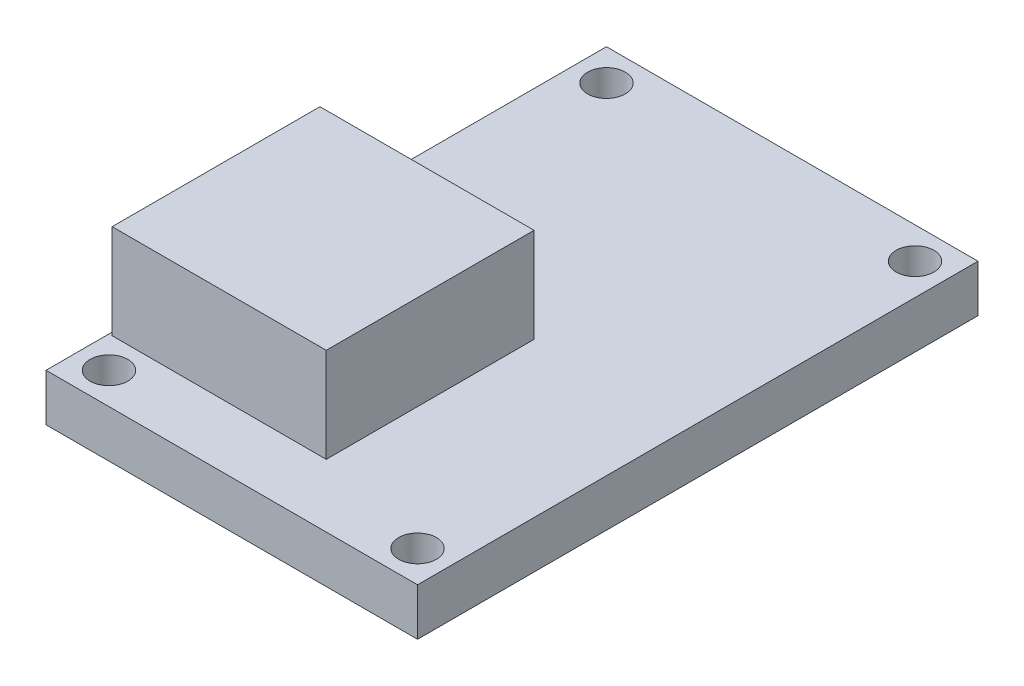
ISO-10303-21;
HEADER;
FILE_DESCRIPTION(('STEP AP214'),'2;1');
FILE_NAME('part.step','',(''),(''),'','','');
FILE_SCHEMA(('AUTOMOTIVE_DESIGN { 1 0 10303 214 1 1 1 1 }'));
ENDSEC;
DATA;
#1=APPLICATION_CONTEXT('core data for automotive mechanical design processes');
#2=APPLICATION_PROTOCOL_DEFINITION('international standard','automotive_design',2000,#1);
#3=PRODUCT_CONTEXT('',#1,'mechanical');
#4=PRODUCT('Part','Part','',(#3));
#5=PRODUCT_RELATED_PRODUCT_CATEGORY('part','',(#4));
#6=PRODUCT_DEFINITION_FORMATION('','',#4);
#7=PRODUCT_DEFINITION_CONTEXT('part definition',#1,'design');
#8=PRODUCT_DEFINITION('design','',#6,#7);
#9=PRODUCT_DEFINITION_SHAPE('','',#8);
#10=(LENGTH_UNIT() NAMED_UNIT(*) SI_UNIT(.MILLI.,.METRE.));
#11=(NAMED_UNIT(*) PLANE_ANGLE_UNIT() SI_UNIT($,.RADIAN.));
#12=(NAMED_UNIT(*) SI_UNIT($,.STERADIAN.) SOLID_ANGLE_UNIT());
#13=UNCERTAINTY_MEASURE_WITH_UNIT(LENGTH_MEASURE(1.E-05),#10,'distance_accuracy_value','');
#14=(GEOMETRIC_REPRESENTATION_CONTEXT(3) GLOBAL_UNCERTAINTY_ASSIGNED_CONTEXT((#13)) GLOBAL_UNIT_ASSIGNED_CONTEXT((#10,
#11,#12)) REPRESENTATION_CONTEXT('',''));
#15=CARTESIAN_POINT('',(0.,0.,0.));
#16=DIRECTION('',(0.,0.,1.));
#17=DIRECTION('',(1.,0.,0.));
#18=AXIS2_PLACEMENT_3D('',#15,#16,#17);
#19=CARTESIAN_POINT('',(0.,1.5,0.));
#20=DIRECTION('',(0.,-1.,0.));
#21=DIRECTION('',(0.,0.,-1.));
#22=AXIS2_PLACEMENT_3D('',#19,#20,#21);
#23=PLANE('',#22);
#24=CARTESIAN_POINT('',(-4.9,1.5,7.9));
#25=DIRECTION('',(0.,1.,0.));
#26=DIRECTION('',(0.,0.,1.));
#27=AXIS2_PLACEMENT_3D('',#24,#25,#26);
#28=CIRCLE('',#27,0.6);
#29=CARTESIAN_POINT('',(-4.9,1.5,8.5));
#30=VERTEX_POINT('',#29);
#31=EDGE_CURVE('E134',#30,#30,#28,.T.);
#32=ORIENTED_EDGE('',*,*,#31,.F.);
#33=EDGE_LOOP('',(#32));
#34=FACE_BOUND('',#33,.T.);
#35=CARTESIAN_POINT('',(4.9,1.5,7.9));
#36=DIRECTION('',(0.,1.,0.));
#37=DIRECTION('',(0.,0.,1.));
#38=AXIS2_PLACEMENT_3D('',#35,#36,#37);
#39=CIRCLE('',#38,0.6);
#40=CARTESIAN_POINT('',(4.9,1.5,8.5));
#41=VERTEX_POINT('',#40);
#42=EDGE_CURVE('E144',#41,#41,#39,.T.);
#43=ORIENTED_EDGE('',*,*,#42,.F.);
#44=EDGE_LOOP('',(#43));
#45=FACE_BOUND('',#44,.T.);
#46=CARTESIAN_POINT('',(4.9,1.5,-7.9));
#47=DIRECTION('',(0.,1.,0.));
#48=DIRECTION('',(0.,0.,1.));
#49=AXIS2_PLACEMENT_3D('',#46,#47,#48);
#50=CIRCLE('',#49,0.6);
#51=CARTESIAN_POINT('',(4.9,1.5,-7.3));
#52=VERTEX_POINT('',#51);
#53=EDGE_CURVE('E152',#52,#52,#50,.T.);
#54=ORIENTED_EDGE('',*,*,#53,.F.);
#55=EDGE_LOOP('',(#54));
#56=FACE_BOUND('',#55,.T.);
#57=CARTESIAN_POINT('',(-4.9,1.5,-7.9));
#58=DIRECTION('',(0.,1.,0.));
#59=DIRECTION('',(0.,0.,1.));
#60=AXIS2_PLACEMENT_3D('',#57,#58,#59);
#61=CIRCLE('',#60,0.6);
#62=CARTESIAN_POINT('',(-4.9,1.5,-7.3));
#63=VERTEX_POINT('',#62);
#64=EDGE_CURVE('E160',#63,#63,#61,.T.);
#65=ORIENTED_EDGE('',*,*,#64,.F.);
#66=EDGE_LOOP('',(#65));
#67=FACE_BOUND('',#66,.T.);
#68=DIRECTION('',(0.,0.,-1.));
#69=VECTOR('',#68,1.);
#70=CARTESIAN_POINT('',(5.9,1.5,8.9));
#71=LINE('',#70,#69);
#72=CARTESIAN_POINT('',(5.9,1.5,8.9));
#73=VERTEX_POINT('',#72);
#74=CARTESIAN_POINT('',(5.9,1.5,-8.9));
#75=VERTEX_POINT('',#74);
#76=EDGE_CURVE('E168',#73,#75,#71,.T.);
#77=ORIENTED_EDGE('',*,*,#76,.T.);
#78=DIRECTION('',(-1.,0.,0.));
#79=VECTOR('',#78,1.);
#80=CARTESIAN_POINT('',(-5.9,1.5,-8.9));
#81=LINE('',#80,#79);
#82=CARTESIAN_POINT('',(-5.9,1.5,-8.9));
#83=VERTEX_POINT('',#82);
#84=EDGE_CURVE('E172',#75,#83,#81,.T.);
#85=ORIENTED_EDGE('',*,*,#84,.T.);
#86=DIRECTION('',(0.,0.,1.));
#87=VECTOR('',#86,1.);
#88=CARTESIAN_POINT('',(-5.9,1.5,8.9));
#89=LINE('',#88,#87);
#90=CARTESIAN_POINT('',(-5.9,1.5,8.9));
#91=VERTEX_POINT('',#90);
#92=EDGE_CURVE('E176',#83,#91,#89,.T.);
#93=ORIENTED_EDGE('',*,*,#92,.T.);
#94=DIRECTION('',(1.,0.,0.));
#95=VECTOR('',#94,1.);
#96=CARTESIAN_POINT('',(-5.9,1.5,8.9));
#97=LINE('',#96,#95);
#98=EDGE_CURVE('E179',#91,#73,#97,.T.);
#99=ORIENTED_EDGE('',*,*,#98,.T.);
#100=EDGE_LOOP('',(#77,#85,#93,#99));
#101=FACE_BOUND('',#100,.T.);
#102=DIRECTION('',(0.,0.,1.));
#103=VECTOR('',#102,1.);
#104=CARTESIAN_POINT('',(-5.8,1.5,0.299999999999996));
#105=LINE('',#104,#103);
#106=CARTESIAN_POINT('',(-5.8,1.5,0.299999999999996));
#107=VERTEX_POINT('',#106);
#108=CARTESIAN_POINT('',(-5.8,1.5,6.9));
#109=VERTEX_POINT('',#108);
#110=EDGE_CURVE('E127',#107,#109,#105,.T.);
#111=ORIENTED_EDGE('',*,*,#110,.F.);
#112=DIRECTION('',(-1.,0.,0.));
#113=VECTOR('',#112,1.);
#114=CARTESIAN_POINT('',(-5.8,1.5,0.299999999999996));
#115=LINE('',#114,#113);
#116=CARTESIAN_POINT('',(1.,1.5,0.299999999999996));
#117=VERTEX_POINT('',#116);
#118=EDGE_CURVE('E124',#117,#107,#115,.T.);
#119=ORIENTED_EDGE('',*,*,#118,.F.);
#120=DIRECTION('',(0.,0.,-1.));
#121=VECTOR('',#120,1.);
#122=CARTESIAN_POINT('',(1.,1.5,0.299999999999996));
#123=LINE('',#122,#121);
#124=CARTESIAN_POINT('',(1.,1.5,6.9));
#125=VERTEX_POINT('',#124);
#126=EDGE_CURVE('E60',#125,#117,#123,.T.);
#127=ORIENTED_EDGE('',*,*,#126,.F.);
#128=DIRECTION('',(1.,0.,0.));
#129=VECTOR('',#128,1.);
#130=CARTESIAN_POINT('',(-5.8,1.5,6.9));
#131=LINE('',#130,#129);
#132=EDGE_CURVE('E55',#109,#125,#131,.T.);
#133=ORIENTED_EDGE('',*,*,#132,.F.);
#134=EDGE_LOOP('',(#111,#119,#127,#133));
#135=FACE_BOUND('',#134,.T.);
#136=ADVANCED_FACE('F39',(#34,#45,#56,#67,#101,#135),#23,.F.);
#137=CARTESIAN_POINT('',(0.,0.,0.));
#138=DIRECTION('',(0.,-1.,0.));
#139=DIRECTION('',(0.,0.,-1.));
#140=AXIS2_PLACEMENT_3D('',#137,#138,#139);
#141=PLANE('',#140);
#142=CARTESIAN_POINT('',(4.9,0.,7.9));
#143=DIRECTION('',(0.,1.,0.));
#144=DIRECTION('',(0.,0.,1.));
#145=AXIS2_PLACEMENT_3D('',#142,#143,#144);
#146=CIRCLE('',#145,0.6);
#147=CARTESIAN_POINT('',(4.9,0.,8.5));
#148=VERTEX_POINT('',#147);
#149=EDGE_CURVE('E142',#148,#148,#146,.T.);
#150=ORIENTED_EDGE('',*,*,#149,.T.);
#151=EDGE_LOOP('',(#150));
#152=FACE_BOUND('',#151,.T.);
#153=CARTESIAN_POINT('',(-4.9,0.,-7.9));
#154=DIRECTION('',(0.,1.,0.));
#155=DIRECTION('',(0.,0.,1.));
#156=AXIS2_PLACEMENT_3D('',#153,#154,#155);
#157=CIRCLE('',#156,0.6);
#158=CARTESIAN_POINT('',(-4.9,0.,-7.3));
#159=VERTEX_POINT('',#158);
#160=EDGE_CURVE('E156',#159,#159,#157,.T.);
#161=ORIENTED_EDGE('',*,*,#160,.T.);
#162=EDGE_LOOP('',(#161));
#163=FACE_BOUND('',#162,.T.);
#164=DIRECTION('',(0.,0.,-1.));
#165=VECTOR('',#164,1.);
#166=CARTESIAN_POINT('',(5.9,0.,8.9));
#167=LINE('',#166,#165);
#168=CARTESIAN_POINT('',(5.9,0.,8.9));
#169=VERTEX_POINT('',#168);
#170=CARTESIAN_POINT('',(5.9,0.,-8.9));
#171=VERTEX_POINT('',#170);
#172=EDGE_CURVE('E164',#169,#171,#167,.T.);
#173=ORIENTED_EDGE('',*,*,#172,.F.);
#174=DIRECTION('',(1.,0.,0.));
#175=VECTOR('',#174,1.);
#176=CARTESIAN_POINT('',(-5.9,0.,8.9));
#177=LINE('',#176,#175);
#178=CARTESIAN_POINT('',(-5.9,0.,8.9));
#179=VERTEX_POINT('',#178);
#180=EDGE_CURVE('E173',#179,#169,#177,.T.);
#181=ORIENTED_EDGE('',*,*,#180,.F.);
#182=DIRECTION('',(0.,0.,1.));
#183=VECTOR('',#182,1.);
#184=CARTESIAN_POINT('',(-5.9,0.,8.9));
#185=LINE('',#184,#183);
#186=CARTESIAN_POINT('',(-5.9,0.,-8.9));
#187=VERTEX_POINT('',#186);
#188=EDGE_CURVE('E189',#187,#179,#185,.T.);
#189=ORIENTED_EDGE('',*,*,#188,.F.);
#190=DIRECTION('',(-1.,0.,0.));
#191=VECTOR('',#190,1.);
#192=CARTESIAN_POINT('',(-5.9,0.,-8.9));
#193=LINE('',#192,#191);
#194=EDGE_CURVE('E186',#171,#187,#193,.T.);
#195=ORIENTED_EDGE('',*,*,#194,.F.);
#196=EDGE_LOOP('',(#173,#181,#189,#195));
#197=FACE_BOUND('',#196,.T.);
#198=CARTESIAN_POINT('',(4.9,0.,-7.9));
#199=DIRECTION('',(0.,1.,0.));
#200=DIRECTION('',(0.,0.,1.));
#201=AXIS2_PLACEMENT_3D('',#198,#199,#200);
#202=CIRCLE('',#201,0.6);
#203=CARTESIAN_POINT('',(4.9,0.,-7.3));
#204=VERTEX_POINT('',#203);
#205=EDGE_CURVE('E148',#204,#204,#202,.T.);
#206=ORIENTED_EDGE('',*,*,#205,.T.);
#207=EDGE_LOOP('',(#206));
#208=FACE_BOUND('',#207,.T.);
#209=CARTESIAN_POINT('',(-4.9,0.,7.9));
#210=DIRECTION('',(0.,1.,0.));
#211=DIRECTION('',(0.,0.,1.));
#212=AXIS2_PLACEMENT_3D('',#209,#210,#211);
#213=CIRCLE('',#212,0.6);
#214=CARTESIAN_POINT('',(-4.9,0.,8.5));
#215=VERTEX_POINT('',#214);
#216=EDGE_CURVE('E129',#215,#215,#213,.T.);
#217=ORIENTED_EDGE('',*,*,#216,.T.);
#218=EDGE_LOOP('',(#217));
#219=FACE_BOUND('',#218,.T.);
#220=ADVANCED_FACE('F212',(#152,#163,#197,#208,#219),#141,.T.);
#221=CARTESIAN_POINT('',(5.9,1.5,8.9));
#222=DIRECTION('',(-1.,0.,0.));
#223=DIRECTION('',(0.,0.,1.));
#224=AXIS2_PLACEMENT_3D('',#221,#222,#223);
#225=PLANE('',#224);
#226=ORIENTED_EDGE('',*,*,#172,.T.);
#227=DIRECTION('',(0.,-1.,0.));
#228=VECTOR('',#227,1.);
#229=CARTESIAN_POINT('',(5.9,1.5,-8.9));
#230=LINE('',#229,#228);
#231=EDGE_CURVE('E11',#75,#171,#230,.T.);
#232=ORIENTED_EDGE('',*,*,#231,.F.);
#233=ORIENTED_EDGE('',*,*,#76,.F.);
#234=DIRECTION('',(0.,-1.,0.));
#235=VECTOR('',#234,1.);
#236=CARTESIAN_POINT('',(5.9,1.5,8.9));
#237=LINE('',#236,#235);
#238=EDGE_CURVE('E182',#73,#169,#237,.T.);
#239=ORIENTED_EDGE('',*,*,#238,.T.);
#240=EDGE_LOOP('',(#226,#232,#233,#239));
#241=FACE_BOUND('',#240,.T.);
#242=ADVANCED_FACE('F41',(#241),#225,.F.);
#243=CARTESIAN_POINT('',(-5.9,1.5,-8.9));
#244=DIRECTION('',(0.,0.,1.));
#245=DIRECTION('',(1.,0.,0.));
#246=AXIS2_PLACEMENT_3D('',#243,#244,#245);
#247=PLANE('',#246);
#248=ORIENTED_EDGE('',*,*,#194,.T.);
#249=DIRECTION('',(0.,-1.,0.));
#250=VECTOR('',#249,1.);
#251=CARTESIAN_POINT('',(-5.9,1.5,-8.9));
#252=LINE('',#251,#250);
#253=EDGE_CURVE('E48',#83,#187,#252,.T.);
#254=ORIENTED_EDGE('',*,*,#253,.F.);
#255=ORIENTED_EDGE('',*,*,#84,.F.);
#256=ORIENTED_EDGE('',*,*,#231,.T.);
#257=EDGE_LOOP('',(#248,#254,#255,#256));
#258=FACE_BOUND('',#257,.T.);
#259=ADVANCED_FACE('F222',(#258),#247,.F.);
#260=CARTESIAN_POINT('',(-5.9,1.5,8.9));
#261=DIRECTION('',(1.,0.,0.));
#262=DIRECTION('',(0.,0.,-1.));
#263=AXIS2_PLACEMENT_3D('',#260,#261,#262);
#264=PLANE('',#263);
#265=ORIENTED_EDGE('',*,*,#188,.T.);
#266=DIRECTION('',(0.,-1.,0.));
#267=VECTOR('',#266,1.);
#268=CARTESIAN_POINT('',(-5.9,1.5,8.9));
#269=LINE('',#268,#267);
#270=EDGE_CURVE('E197',#91,#179,#269,.T.);
#271=ORIENTED_EDGE('',*,*,#270,.F.);
#272=ORIENTED_EDGE('',*,*,#92,.F.);
#273=ORIENTED_EDGE('',*,*,#253,.T.);
#274=EDGE_LOOP('',(#265,#271,#272,#273));
#275=FACE_BOUND('',#274,.T.);
#276=ADVANCED_FACE('F206',(#275),#264,.F.);
#277=CARTESIAN_POINT('',(-5.9,1.5,8.9));
#278=DIRECTION('',(0.,0.,-1.));
#279=DIRECTION('',(-1.,0.,0.));
#280=AXIS2_PLACEMENT_3D('',#277,#278,#279);
#281=PLANE('',#280);
#282=ORIENTED_EDGE('',*,*,#180,.T.);
#283=ORIENTED_EDGE('',*,*,#238,.F.);
#284=ORIENTED_EDGE('',*,*,#98,.F.);
#285=ORIENTED_EDGE('',*,*,#270,.T.);
#286=EDGE_LOOP('',(#282,#283,#284,#285));
#287=FACE_BOUND('',#286,.T.);
#288=ADVANCED_FACE('F216',(#287),#281,.F.);
#289=CARTESIAN_POINT('',(-4.9,1.5,-7.9));
#290=DIRECTION('',(0.,-1.,0.));
#291=DIRECTION('',(0.,0.,-1.));
#292=AXIS2_PLACEMENT_3D('',#289,#290,#291);
#293=CYLINDRICAL_SURFACE('',#292,0.6);
#294=ORIENTED_EDGE('',*,*,#64,.T.);
#295=EDGE_LOOP('',(#294));
#296=FACE_BOUND('',#295,.T.);
#297=ORIENTED_EDGE('',*,*,#160,.F.);
#298=EDGE_LOOP('',(#297));
#299=FACE_BOUND('',#298,.T.);
#300=ADVANCED_FACE('F240',(#296,#299),#293,.F.);
#301=CARTESIAN_POINT('',(4.9,1.5,-7.9));
#302=DIRECTION('',(0.,-1.,0.));
#303=DIRECTION('',(0.,0.,-1.));
#304=AXIS2_PLACEMENT_3D('',#301,#302,#303);
#305=CYLINDRICAL_SURFACE('',#304,0.6);
#306=ORIENTED_EDGE('',*,*,#53,.T.);
#307=EDGE_LOOP('',(#306));
#308=FACE_BOUND('',#307,.T.);
#309=ORIENTED_EDGE('',*,*,#205,.F.);
#310=EDGE_LOOP('',(#309));
#311=FACE_BOUND('',#310,.T.);
#312=ADVANCED_FACE('F247',(#308,#311),#305,.F.);
#313=CARTESIAN_POINT('',(4.9,1.5,7.9));
#314=DIRECTION('',(0.,-1.,0.));
#315=DIRECTION('',(0.,0.,-1.));
#316=AXIS2_PLACEMENT_3D('',#313,#314,#315);
#317=CYLINDRICAL_SURFACE('',#316,0.6);
#318=ORIENTED_EDGE('',*,*,#42,.T.);
#319=EDGE_LOOP('',(#318));
#320=FACE_BOUND('',#319,.T.);
#321=ORIENTED_EDGE('',*,*,#149,.F.);
#322=EDGE_LOOP('',(#321));
#323=FACE_BOUND('',#322,.T.);
#324=ADVANCED_FACE('F252',(#320,#323),#317,.F.);
#325=CARTESIAN_POINT('',(-4.9,1.5,7.9));
#326=DIRECTION('',(0.,-1.,0.));
#327=DIRECTION('',(0.,0.,-1.));
#328=AXIS2_PLACEMENT_3D('',#325,#326,#327);
#329=CYLINDRICAL_SURFACE('',#328,0.6);
#330=ORIENTED_EDGE('',*,*,#31,.T.);
#331=EDGE_LOOP('',(#330));
#332=FACE_BOUND('',#331,.T.);
#333=ORIENTED_EDGE('',*,*,#216,.F.);
#334=EDGE_LOOP('',(#333));
#335=FACE_BOUND('',#334,.T.);
#336=ADVANCED_FACE('F262',(#332,#335),#329,.F.);
#337=CARTESIAN_POINT('',(-5.8,4.5,0.299999999999996));
#338=DIRECTION('',(1.,0.,0.));
#339=DIRECTION('',(0.,0.,-1.));
#340=AXIS2_PLACEMENT_3D('',#337,#338,#339);
#341=PLANE('',#340);
#342=ORIENTED_EDGE('',*,*,#110,.T.);
#343=DIRECTION('',(0.,-1.,0.));
#344=VECTOR('',#343,1.);
#345=CARTESIAN_POINT('',(-5.8,4.5,6.9));
#346=LINE('',#345,#344);
#347=CARTESIAN_POINT('',(-5.8,4.5,6.9));
#348=VERTEX_POINT('',#347);
#349=EDGE_CURVE('E106',#348,#109,#346,.T.);
#350=ORIENTED_EDGE('',*,*,#349,.F.);
#351=DIRECTION('',(0.,0.,1.));
#352=VECTOR('',#351,1.);
#353=CARTESIAN_POINT('',(-5.8,4.5,0.299999999999996));
#354=LINE('',#353,#352);
#355=CARTESIAN_POINT('',(-5.8,4.5,0.299999999999996));
#356=VERTEX_POINT('',#355);
#357=EDGE_CURVE('E114',#356,#348,#354,.T.);
#358=ORIENTED_EDGE('',*,*,#357,.F.);
#359=DIRECTION('',(0.,-1.,0.));
#360=VECTOR('',#359,1.);
#361=CARTESIAN_POINT('',(-5.8,4.5,0.299999999999996));
#362=LINE('',#361,#360);
#363=EDGE_CURVE('E365',#356,#107,#362,.T.);
#364=ORIENTED_EDGE('',*,*,#363,.T.);
#365=EDGE_LOOP('',(#342,#350,#358,#364));
#366=FACE_BOUND('',#365,.T.);
#367=ADVANCED_FACE('F126',(#366),#341,.F.);
#368=CARTESIAN_POINT('',(-5.8,4.5,6.9));
#369=DIRECTION('',(0.,0.,-1.));
#370=DIRECTION('',(-1.,0.,0.));
#371=AXIS2_PLACEMENT_3D('',#368,#369,#370);
#372=PLANE('',#371);
#373=ORIENTED_EDGE('',*,*,#132,.T.);
#374=DIRECTION('',(0.,-1.,0.));
#375=VECTOR('',#374,1.);
#376=CARTESIAN_POINT('',(1.,4.5,6.9));
#377=LINE('',#376,#375);
#378=CARTESIAN_POINT('',(1.,4.5,6.9));
#379=VERTEX_POINT('',#378);
#380=EDGE_CURVE('E109',#379,#125,#377,.T.);
#381=ORIENTED_EDGE('',*,*,#380,.F.);
#382=DIRECTION('',(1.,0.,0.));
#383=VECTOR('',#382,1.);
#384=CARTESIAN_POINT('',(-5.8,4.5,6.9));
#385=LINE('',#384,#383);
#386=EDGE_CURVE('E102',#348,#379,#385,.T.);
#387=ORIENTED_EDGE('',*,*,#386,.F.);
#388=ORIENTED_EDGE('',*,*,#349,.T.);
#389=EDGE_LOOP('',(#373,#381,#387,#388));
#390=FACE_BOUND('',#389,.T.);
#391=ADVANCED_FACE('F104',(#390),#372,.F.);
#392=CARTESIAN_POINT('',(1.,4.5,0.299999999999996));
#393=DIRECTION('',(-1.,0.,0.));
#394=DIRECTION('',(0.,0.,1.));
#395=AXIS2_PLACEMENT_3D('',#392,#393,#394);
#396=PLANE('',#395);
#397=ORIENTED_EDGE('',*,*,#126,.T.);
#398=DIRECTION('',(0.,-1.,0.));
#399=VECTOR('',#398,1.);
#400=CARTESIAN_POINT('',(1.,4.5,0.299999999999996));
#401=LINE('',#400,#399);
#402=CARTESIAN_POINT('',(1.,4.5,0.299999999999996));
#403=VERTEX_POINT('',#402);
#404=EDGE_CURVE('E136',#403,#117,#401,.T.);
#405=ORIENTED_EDGE('',*,*,#404,.F.);
#406=DIRECTION('',(0.,0.,-1.));
#407=VECTOR('',#406,1.);
#408=CARTESIAN_POINT('',(1.,4.5,0.299999999999996));
#409=LINE('',#408,#407);
#410=EDGE_CURVE('E113',#379,#403,#409,.T.);
#411=ORIENTED_EDGE('',*,*,#410,.F.);
#412=ORIENTED_EDGE('',*,*,#380,.T.);
#413=EDGE_LOOP('',(#397,#405,#411,#412));
#414=FACE_BOUND('',#413,.T.);
#415=ADVANCED_FACE('F274',(#414),#396,.F.);
#416=CARTESIAN_POINT('',(-5.8,4.5,0.299999999999996));
#417=DIRECTION('',(0.,0.,1.));
#418=DIRECTION('',(1.,0.,0.));
#419=AXIS2_PLACEMENT_3D('',#416,#417,#418);
#420=PLANE('',#419);
#421=ORIENTED_EDGE('',*,*,#118,.T.);
#422=ORIENTED_EDGE('',*,*,#363,.F.);
#423=DIRECTION('',(-1.,0.,0.));
#424=VECTOR('',#423,1.);
#425=CARTESIAN_POINT('',(-5.8,4.5,0.299999999999996));
#426=LINE('',#425,#424);
#427=EDGE_CURVE('E119',#403,#356,#426,.T.);
#428=ORIENTED_EDGE('',*,*,#427,.F.);
#429=ORIENTED_EDGE('',*,*,#404,.T.);
#430=EDGE_LOOP('',(#421,#422,#428,#429));
#431=FACE_BOUND('',#430,.T.);
#432=ADVANCED_FACE('F277',(#431),#420,.F.);
#433=CARTESIAN_POINT('',(0.,4.5,0.));
#434=DIRECTION('',(0.,1.,0.));
#435=DIRECTION('',(0.,0.,1.));
#436=AXIS2_PLACEMENT_3D('',#433,#434,#435);
#437=PLANE('',#436);
#438=ORIENTED_EDGE('',*,*,#357,.T.);
#439=ORIENTED_EDGE('',*,*,#386,.T.);
#440=ORIENTED_EDGE('',*,*,#410,.T.);
#441=ORIENTED_EDGE('',*,*,#427,.T.);
#442=EDGE_LOOP('',(#438,#439,#440,#441));
#443=FACE_BOUND('',#442,.T.);
#444=ADVANCED_FACE('F117',(#443),#437,.T.);
#445=CLOSED_SHELL('',(#136,#220,#242,#259,#276,#288,#300,#312,#324,#336,#367,#391,#415,#432,#444));
#446=MANIFOLD_SOLID_BREP('B2',#445);
#447=ADVANCED_BREP_SHAPE_REPRESENTATION('',(#18,#446),#14);
#448=SHAPE_DEFINITION_REPRESENTATION(#9,#447);
ENDSEC;
END-ISO-10303-21;
